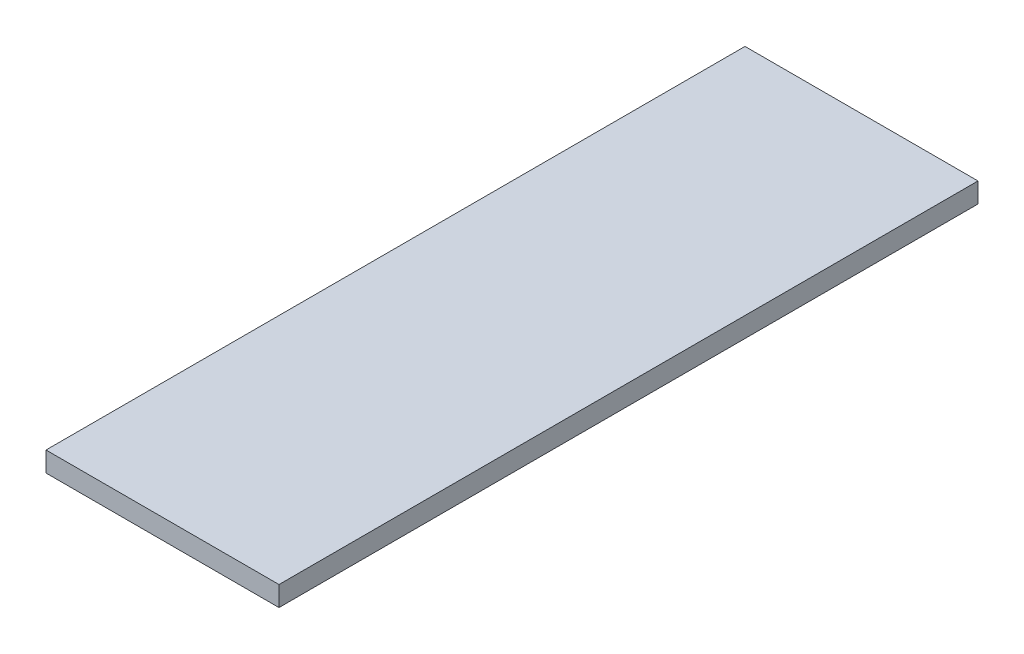
ISO-10303-21;
HEADER;
FILE_DESCRIPTION(('STEP AP214'),'2;1');
FILE_NAME('part.step','',(''),(''),'','','');
FILE_SCHEMA(('AUTOMOTIVE_DESIGN { 1 0 10303 214 1 1 1 1 }'));
ENDSEC;
DATA;
#1=APPLICATION_CONTEXT('core data for automotive mechanical design processes');
#2=APPLICATION_PROTOCOL_DEFINITION('international standard','automotive_design',2000,#1);
#3=PRODUCT_CONTEXT('',#1,'mechanical');
#4=PRODUCT('Part','Part','',(#3));
#5=PRODUCT_RELATED_PRODUCT_CATEGORY('part','',(#4));
#6=PRODUCT_DEFINITION_FORMATION('','',#4);
#7=PRODUCT_DEFINITION_CONTEXT('part definition',#1,'design');
#8=PRODUCT_DEFINITION('design','',#6,#7);
#9=PRODUCT_DEFINITION_SHAPE('','',#8);
#10=(LENGTH_UNIT() NAMED_UNIT(*) SI_UNIT(.MILLI.,.METRE.));
#11=(NAMED_UNIT(*) PLANE_ANGLE_UNIT() SI_UNIT($,.RADIAN.));
#12=(NAMED_UNIT(*) SI_UNIT($,.STERADIAN.) SOLID_ANGLE_UNIT());
#13=UNCERTAINTY_MEASURE_WITH_UNIT(LENGTH_MEASURE(1.E-05),#10,'distance_accuracy_value','');
#14=(GEOMETRIC_REPRESENTATION_CONTEXT(3) GLOBAL_UNCERTAINTY_ASSIGNED_CONTEXT((#13)) GLOBAL_UNIT_ASSIGNED_CONTEXT((#10,
#11,#12)) REPRESENTATION_CONTEXT('',''));
#15=CARTESIAN_POINT('',(0.,0.,0.));
#16=DIRECTION('',(0.,0.,1.));
#17=DIRECTION('',(1.,0.,0.));
#18=AXIS2_PLACEMENT_3D('',#15,#16,#17);
#19=CARTESIAN_POINT('',(-17.5,3.,52.5));
#20=DIRECTION('',(1.,0.,0.));
#21=DIRECTION('',(0.,0.,-1.));
#22=AXIS2_PLACEMENT_3D('',#19,#20,#21);
#23=PLANE('',#22);
#24=DIRECTION('',(0.,0.,1.));
#25=VECTOR('',#24,1.);
#26=CARTESIAN_POINT('',(-17.5,0.,52.5));
#27=LINE('',#26,#25);
#28=CARTESIAN_POINT('',(-17.5,0.,-52.5));
#29=VERTEX_POINT('',#28);
#30=CARTESIAN_POINT('',(-17.5,0.,52.5));
#31=VERTEX_POINT('',#30);
#32=EDGE_CURVE('E96',#29,#31,#27,.T.);
#33=ORIENTED_EDGE('',*,*,#32,.T.);
#34=DIRECTION('',(0.,-1.,0.));
#35=VECTOR('',#34,1.);
#36=CARTESIAN_POINT('',(-17.5,3.,52.5));
#37=LINE('',#36,#35);
#38=CARTESIAN_POINT('',(-17.5,3.,52.5));
#39=VERTEX_POINT('',#38);
#40=EDGE_CURVE('E11',#39,#31,#37,.T.);
#41=ORIENTED_EDGE('',*,*,#40,.F.);
#42=DIRECTION('',(0.,0.,1.));
#43=VECTOR('',#42,1.);
#44=CARTESIAN_POINT('',(-17.5,3.,52.5));
#45=LINE('',#44,#43);
#46=CARTESIAN_POINT('',(-17.5,3.,-52.5));
#47=VERTEX_POINT('',#46);
#48=EDGE_CURVE('E84',#47,#39,#45,.T.);
#49=ORIENTED_EDGE('',*,*,#48,.F.);
#50=DIRECTION('',(0.,-1.,0.));
#51=VECTOR('',#50,1.);
#52=CARTESIAN_POINT('',(-17.5,3.,-52.5));
#53=LINE('',#52,#51);
#54=EDGE_CURVE('E92',#47,#29,#53,.T.);
#55=ORIENTED_EDGE('',*,*,#54,.T.);
#56=EDGE_LOOP('',(#33,#41,#49,#55));
#57=FACE_BOUND('',#56,.T.);
#58=ADVANCED_FACE('F33',(#57),#23,.F.);
#59=CARTESIAN_POINT('',(17.5,3.,52.5));
#60=DIRECTION('',(0.,0.,-1.));
#61=DIRECTION('',(-1.,0.,0.));
#62=AXIS2_PLACEMENT_3D('',#59,#60,#61);
#63=PLANE('',#62);
#64=DIRECTION('',(1.,0.,0.));
#65=VECTOR('',#64,1.);
#66=CARTESIAN_POINT('',(17.5,0.,52.5));
#67=LINE('',#66,#65);
#68=CARTESIAN_POINT('',(17.5,0.,52.5));
#69=VERTEX_POINT('',#68);
#70=EDGE_CURVE('E88',#31,#69,#67,.T.);
#71=ORIENTED_EDGE('',*,*,#70,.T.);
#72=DIRECTION('',(0.,-1.,0.));
#73=VECTOR('',#72,1.);
#74=CARTESIAN_POINT('',(17.5,3.,52.5));
#75=LINE('',#74,#73);
#76=CARTESIAN_POINT('',(17.5,3.,52.5));
#77=VERTEX_POINT('',#76);
#78=EDGE_CURVE('E41',#77,#69,#75,.T.);
#79=ORIENTED_EDGE('',*,*,#78,.F.);
#80=DIRECTION('',(1.,0.,0.));
#81=VECTOR('',#80,1.);
#82=CARTESIAN_POINT('',(17.5,3.,52.5));
#83=LINE('',#82,#81);
#84=EDGE_CURVE('E79',#39,#77,#83,.T.);
#85=ORIENTED_EDGE('',*,*,#84,.F.);
#86=ORIENTED_EDGE('',*,*,#40,.T.);
#87=EDGE_LOOP('',(#71,#79,#85,#86));
#88=FACE_BOUND('',#87,.T.);
#89=ADVANCED_FACE('F87',(#88),#63,.F.);
#90=CARTESIAN_POINT('',(17.5,3.,52.5));
#91=DIRECTION('',(-1.,0.,0.));
#92=DIRECTION('',(0.,0.,1.));
#93=AXIS2_PLACEMENT_3D('',#90,#91,#92);
#94=PLANE('',#93);
#95=DIRECTION('',(0.,0.,-1.));
#96=VECTOR('',#95,1.);
#97=CARTESIAN_POINT('',(17.5,0.,52.5));
#98=LINE('',#97,#96);
#99=CARTESIAN_POINT('',(17.5,0.,-52.5));
#100=VERTEX_POINT('',#99);
#101=EDGE_CURVE('E66',#69,#100,#98,.T.);
#102=ORIENTED_EDGE('',*,*,#101,.T.);
#103=DIRECTION('',(0.,-1.,0.));
#104=VECTOR('',#103,1.);
#105=CARTESIAN_POINT('',(17.5,3.,-52.5));
#106=LINE('',#105,#104);
#107=CARTESIAN_POINT('',(17.5,3.,-52.5));
#108=VERTEX_POINT('',#107);
#109=EDGE_CURVE('E89',#108,#100,#106,.T.);
#110=ORIENTED_EDGE('',*,*,#109,.F.);
#111=DIRECTION('',(0.,0.,-1.));
#112=VECTOR('',#111,1.);
#113=CARTESIAN_POINT('',(17.5,3.,52.5));
#114=LINE('',#113,#112);
#115=EDGE_CURVE('E82',#77,#108,#114,.T.);
#116=ORIENTED_EDGE('',*,*,#115,.F.);
#117=ORIENTED_EDGE('',*,*,#78,.T.);
#118=EDGE_LOOP('',(#102,#110,#116,#117));
#119=FACE_BOUND('',#118,.T.);
#120=ADVANCED_FACE('F90',(#119),#94,.F.);
#121=CARTESIAN_POINT('',(17.5,3.,-52.5));
#122=DIRECTION('',(0.,0.,1.));
#123=DIRECTION('',(1.,0.,0.));
#124=AXIS2_PLACEMENT_3D('',#121,#122,#123);
#125=PLANE('',#124);
#126=DIRECTION('',(-1.,0.,0.));
#127=VECTOR('',#126,1.);
#128=CARTESIAN_POINT('',(17.5,0.,-52.5));
#129=LINE('',#128,#127);
#130=EDGE_CURVE('E72',#100,#29,#129,.T.);
#131=ORIENTED_EDGE('',*,*,#130,.T.);
#132=ORIENTED_EDGE('',*,*,#54,.F.);
#133=DIRECTION('',(-1.,0.,0.));
#134=VECTOR('',#133,1.);
#135=CARTESIAN_POINT('',(17.5,3.,-52.5));
#136=LINE('',#135,#134);
#137=EDGE_CURVE('E49',#108,#47,#136,.T.);
#138=ORIENTED_EDGE('',*,*,#137,.F.);
#139=ORIENTED_EDGE('',*,*,#109,.T.);
#140=EDGE_LOOP('',(#131,#132,#138,#139));
#141=FACE_BOUND('',#140,.T.);
#142=ADVANCED_FACE('F103',(#141),#125,.F.);
#143=CARTESIAN_POINT('',(0.,3.,0.));
#144=DIRECTION('',(0.,1.,0.));
#145=DIRECTION('',(0.,0.,1.));
#146=AXIS2_PLACEMENT_3D('',#143,#144,#145);
#147=PLANE('',#146);
#148=ORIENTED_EDGE('',*,*,#48,.T.);
#149=ORIENTED_EDGE('',*,*,#84,.T.);
#150=ORIENTED_EDGE('',*,*,#115,.T.);
#151=ORIENTED_EDGE('',*,*,#137,.T.);
#152=EDGE_LOOP('',(#148,#149,#150,#151));
#153=FACE_BOUND('',#152,.T.);
#154=ADVANCED_FACE('F80',(#153),#147,.T.);
#155=CARTESIAN_POINT('',(0.,0.,0.));
#156=DIRECTION('',(0.,1.,0.));
#157=DIRECTION('',(0.,0.,1.));
#158=AXIS2_PLACEMENT_3D('',#155,#156,#157);
#159=PLANE('',#158);
#160=ORIENTED_EDGE('',*,*,#32,.F.);
#161=ORIENTED_EDGE('',*,*,#130,.F.);
#162=ORIENTED_EDGE('',*,*,#101,.F.);
#163=ORIENTED_EDGE('',*,*,#70,.F.);
#164=EDGE_LOOP('',(#160,#161,#162,#163));
#165=FACE_BOUND('',#164,.T.);
#166=ADVANCED_FACE('F106',(#165),#159,.F.);
#167=CLOSED_SHELL('',(#58,#89,#120,#142,#154,#166));
#168=MANIFOLD_SOLID_BREP('B2',#167);
#169=ADVANCED_BREP_SHAPE_REPRESENTATION('',(#18,#168),#14);
#170=SHAPE_DEFINITION_REPRESENTATION(#9,#169);
ENDSEC;
END-ISO-10303-21;
